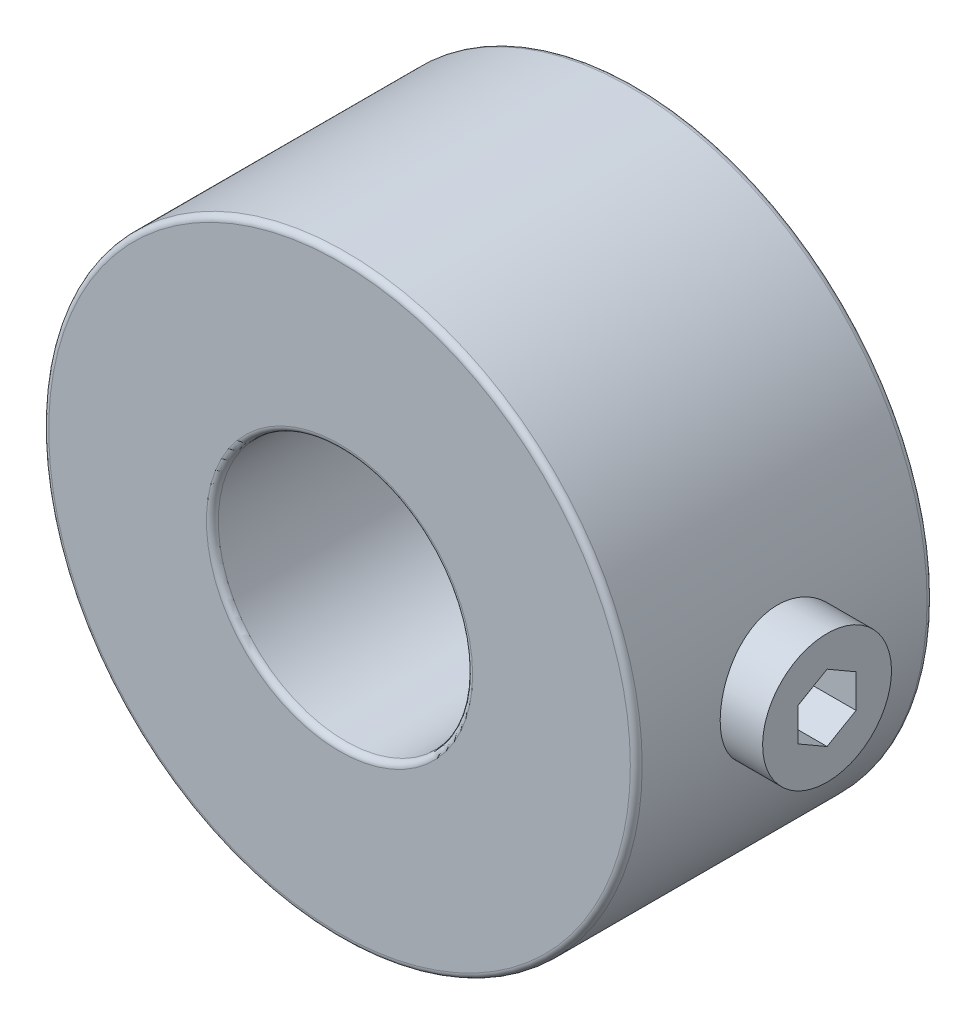
ISO-10303-21;
HEADER;
FILE_DESCRIPTION(('STEP AP214'),'2;1');
FILE_NAME('part.step','',(''),(''),'','','');
FILE_SCHEMA(('AUTOMOTIVE_DESIGN { 1 0 10303 214 1 1 1 1 }'));
ENDSEC;
DATA;
#1=APPLICATION_CONTEXT('core data for automotive mechanical design processes');
#2=APPLICATION_PROTOCOL_DEFINITION('international standard','automotive_design',2000,#1);
#3=PRODUCT_CONTEXT('',#1,'mechanical');
#4=PRODUCT('Part','Part','',(#3));
#5=PRODUCT_RELATED_PRODUCT_CATEGORY('part','',(#4));
#6=PRODUCT_DEFINITION_FORMATION('','',#4);
#7=PRODUCT_DEFINITION_CONTEXT('part definition',#1,'design');
#8=PRODUCT_DEFINITION('design','',#6,#7);
#9=PRODUCT_DEFINITION_SHAPE('','',#8);
#10=(LENGTH_UNIT() NAMED_UNIT(*) SI_UNIT(.MILLI.,.METRE.));
#11=(NAMED_UNIT(*) PLANE_ANGLE_UNIT() SI_UNIT($,.RADIAN.));
#12=(NAMED_UNIT(*) SI_UNIT($,.STERADIAN.) SOLID_ANGLE_UNIT());
#13=UNCERTAINTY_MEASURE_WITH_UNIT(LENGTH_MEASURE(1.E-05),#10,'distance_accuracy_value','');
#14=(GEOMETRIC_REPRESENTATION_CONTEXT(3) GLOBAL_UNCERTAINTY_ASSIGNED_CONTEXT((#13)) GLOBAL_UNIT_ASSIGNED_CONTEXT((#10,
#11,#12)) REPRESENTATION_CONTEXT('',''));
#15=CARTESIAN_POINT('',(0.,0.,0.));
#16=DIRECTION('',(0.,0.,1.));
#17=DIRECTION('',(1.,0.,0.));
#18=AXIS2_PLACEMENT_3D('',#15,#16,#17);
#19=CARTESIAN_POINT('',(6.35,0.,5.55625));
#20=DIRECTION('',(1.,0.,0.));
#21=DIRECTION('',(0.,1.,0.));
#22=AXIS2_PLACEMENT_3D('',#19,#20,#21);
#23=PLANE('',#22);
#24=CARTESIAN_POINT('',(6.35,0.,5.55625));
#25=DIRECTION('',(-1.,0.,0.));
#26=DIRECTION('',(0.,-1.,0.));
#27=AXIS2_PLACEMENT_3D('',#24,#25,#26);
#28=CIRCLE('',#27,2.413);
#29=CARTESIAN_POINT('',(6.35,-2.41300000000001,5.55625));
#30=VERTEX_POINT('',#29);
#31=EDGE_CURVE('E12',#30,#30,#28,.T.);
#32=ORIENTED_EDGE('',*,*,#31,.T.);
#33=EDGE_LOOP('',(#32));
#34=FACE_BOUND('',#33,.T.);
#35=ADVANCED_FACE('F44',(#34),#23,.F.);
#36=CARTESIAN_POINT('',(6.34999999999999,0.,5.55625));
#37=DIRECTION('',(-1.,0.,0.));
#38=DIRECTION('',(0.,-1.,0.));
#39=AXIS2_PLACEMENT_3D('',#36,#37,#38);
#40=CYLINDRICAL_SURFACE('',#39,2.413);
#41=ORIENTED_EDGE('',*,*,#31,.F.);
#42=EDGE_LOOP('',(#41));
#43=FACE_BOUND('',#42,.T.);
#44=CARTESIAN_POINT('',(12.7,0.,5.55625));
#45=DIRECTION('',(-1.,0.,0.));
#46=DIRECTION('',(0.,-1.,0.));
#47=AXIS2_PLACEMENT_3D('',#44,#45,#46);
#48=CIRCLE('',#47,2.413);
#49=CARTESIAN_POINT('',(12.7,-2.413,5.55625));
#50=VERTEX_POINT('',#49);
#51=EDGE_CURVE('E51',#50,#50,#48,.T.);
#52=ORIENTED_EDGE('',*,*,#51,.T.);
#53=EDGE_LOOP('',(#52));
#54=FACE_BOUND('',#53,.T.);
#55=ADVANCED_FACE('F154',(#43,#54),#40,.T.);
#56=CARTESIAN_POINT('',(12.7,0.,5.55625));
#57=DIRECTION('',(-1.,0.,0.));
#58=DIRECTION('',(0.,-1.,0.));
#59=AXIS2_PLACEMENT_3D('',#56,#57,#58);
#60=PLANE('',#59);
#61=DIRECTION('',(0.,-0.5,0.866025403784439));
#62=VECTOR('',#61,1.);
#63=CARTESIAN_POINT('',(12.7,1.25383157959913,5.55625));
#64=LINE('',#63,#62);
#65=CARTESIAN_POINT('',(12.7,1.25383157959913,5.55625));
#66=VERTEX_POINT('',#65);
#67=CARTESIAN_POINT('',(12.7,0.626915789799572,6.6421));
#68=VERTEX_POINT('',#67);
#69=EDGE_CURVE('E112',#66,#68,#64,.T.);
#70=ORIENTED_EDGE('',*,*,#69,.F.);
#71=DIRECTION('',(0.,0.5,0.866025403784439));
#72=VECTOR('',#71,1.);
#73=CARTESIAN_POINT('',(12.7,0.626915789799572,4.4704));
#74=LINE('',#73,#72);
#75=CARTESIAN_POINT('',(12.7,0.626915789799572,4.4704));
#76=VERTEX_POINT('',#75);
#77=EDGE_CURVE('E58',#76,#66,#74,.T.);
#78=ORIENTED_EDGE('',*,*,#77,.F.);
#79=DIRECTION('',(0.,1.,0.));
#80=VECTOR('',#79,1.);
#81=CARTESIAN_POINT('',(12.7,-0.626915789799543,4.4704));
#82=LINE('',#81,#80);
#83=CARTESIAN_POINT('',(12.7,-0.626915789799543,4.4704));
#84=VERTEX_POINT('',#83);
#85=EDGE_CURVE('E128',#84,#76,#82,.T.);
#86=ORIENTED_EDGE('',*,*,#85,.F.);
#87=DIRECTION('',(0.,0.5,-0.866025403784439));
#88=VECTOR('',#87,1.);
#89=CARTESIAN_POINT('',(12.7,-1.2538315795991,5.55625));
#90=LINE('',#89,#88);
#91=CARTESIAN_POINT('',(12.7,-1.2538315795991,5.55625));
#92=VERTEX_POINT('',#91);
#93=EDGE_CURVE('E122',#92,#84,#90,.T.);
#94=ORIENTED_EDGE('',*,*,#93,.F.);
#95=DIRECTION('',(0.,-0.5,-0.866025403784439));
#96=VECTOR('',#95,1.);
#97=CARTESIAN_POINT('',(12.7,-0.626915789799542,6.6421));
#98=LINE('',#97,#96);
#99=CARTESIAN_POINT('',(12.7,-0.626915789799542,6.6421));
#100=VERTEX_POINT('',#99);
#101=EDGE_CURVE('E120',#100,#92,#98,.T.);
#102=ORIENTED_EDGE('',*,*,#101,.F.);
#103=DIRECTION('',(0.,-1.,0.));
#104=VECTOR('',#103,1.);
#105=CARTESIAN_POINT('',(12.7,0.626915789799572,6.6421));
#106=LINE('',#105,#104);
#107=EDGE_CURVE('E101',#68,#100,#106,.T.);
#108=ORIENTED_EDGE('',*,*,#107,.F.);
#109=EDGE_LOOP('',(#70,#78,#86,#94,#102,#108));
#110=FACE_BOUND('',#109,.T.);
#111=ORIENTED_EDGE('',*,*,#51,.F.);
#112=EDGE_LOOP('',(#111));
#113=FACE_BOUND('',#112,.T.);
#114=ADVANCED_FACE('F116',(#110,#113),#60,.F.);
#115=CARTESIAN_POINT('',(11.1125,0.626915789799572,4.4704));
#116=DIRECTION('',(0.,0.866025403784439,-0.5));
#117=DIRECTION('',(0.,0.5,0.866025403784439));
#118=AXIS2_PLACEMENT_3D('',#115,#116,#117);
#119=PLANE('',#118);
#120=ORIENTED_EDGE('',*,*,#77,.T.);
#121=DIRECTION('',(1.,0.,0.));
#122=VECTOR('',#121,1.);
#123=CARTESIAN_POINT('',(11.1125,1.25383157959913,5.55625));
#124=LINE('',#123,#122);
#125=CARTESIAN_POINT('',(11.1125,1.25383157959913,5.55625));
#126=VERTEX_POINT('',#125);
#127=EDGE_CURVE('E109',#126,#66,#124,.T.);
#128=ORIENTED_EDGE('',*,*,#127,.F.);
#129=DIRECTION('',(0.,0.5,0.866025403784439));
#130=VECTOR('',#129,1.);
#131=CARTESIAN_POINT('',(11.1125,0.626915789799572,4.4704));
#132=LINE('',#131,#130);
#133=CARTESIAN_POINT('',(11.1125,0.626915789799572,4.4704));
#134=VERTEX_POINT('',#133);
#135=EDGE_CURVE('E130',#134,#126,#132,.T.);
#136=ORIENTED_EDGE('',*,*,#135,.F.);
#137=DIRECTION('',(1.,0.,0.));
#138=VECTOR('',#137,1.);
#139=CARTESIAN_POINT('',(11.1125,0.626915789799572,4.4704));
#140=LINE('',#139,#138);
#141=EDGE_CURVE('E65',#134,#76,#140,.T.);
#142=ORIENTED_EDGE('',*,*,#141,.T.);
#143=EDGE_LOOP('',(#120,#128,#136,#142));
#144=FACE_BOUND('',#143,.T.);
#145=ADVANCED_FACE('F156',(#144),#119,.F.);
#146=CARTESIAN_POINT('',(11.1125,-0.626915789799543,4.4704));
#147=DIRECTION('',(0.,0.,-1.));
#148=DIRECTION('',(-1.,0.,0.));
#149=AXIS2_PLACEMENT_3D('',#146,#147,#148);
#150=PLANE('',#149);
#151=ORIENTED_EDGE('',*,*,#85,.T.);
#152=ORIENTED_EDGE('',*,*,#141,.F.);
#153=DIRECTION('',(0.,1.,0.));
#154=VECTOR('',#153,1.);
#155=CARTESIAN_POINT('',(11.1125,-0.626915789799543,4.4704));
#156=LINE('',#155,#154);
#157=CARTESIAN_POINT('',(11.1125,-0.626915789799543,4.4704));
#158=VERTEX_POINT('',#157);
#159=EDGE_CURVE('E142',#158,#134,#156,.T.);
#160=ORIENTED_EDGE('',*,*,#159,.F.);
#161=DIRECTION('',(1.,0.,0.));
#162=VECTOR('',#161,1.);
#163=CARTESIAN_POINT('',(11.1125,-0.626915789799543,4.4704));
#164=LINE('',#163,#162);
#165=EDGE_CURVE('E146',#158,#84,#164,.T.);
#166=ORIENTED_EDGE('',*,*,#165,.T.);
#167=EDGE_LOOP('',(#151,#152,#160,#166));
#168=FACE_BOUND('',#167,.T.);
#169=ADVANCED_FACE('F162',(#168),#150,.F.);
#170=CARTESIAN_POINT('',(11.1125,-1.2538315795991,5.55625));
#171=DIRECTION('',(0.,-0.866025403784439,-0.5));
#172=DIRECTION('',(0.,0.5,-0.866025403784439));
#173=AXIS2_PLACEMENT_3D('',#170,#171,#172);
#174=PLANE('',#173);
#175=ORIENTED_EDGE('',*,*,#93,.T.);
#176=ORIENTED_EDGE('',*,*,#165,.F.);
#177=DIRECTION('',(0.,0.5,-0.866025403784439));
#178=VECTOR('',#177,1.);
#179=CARTESIAN_POINT('',(11.1125,-1.2538315795991,5.55625));
#180=LINE('',#179,#178);
#181=CARTESIAN_POINT('',(11.1125,-1.2538315795991,5.55625));
#182=VERTEX_POINT('',#181);
#183=EDGE_CURVE('E139',#182,#158,#180,.T.);
#184=ORIENTED_EDGE('',*,*,#183,.F.);
#185=DIRECTION('',(1.,0.,0.));
#186=VECTOR('',#185,1.);
#187=CARTESIAN_POINT('',(11.1125,-1.2538315795991,5.55625));
#188=LINE('',#187,#186);
#189=EDGE_CURVE('E148',#182,#92,#188,.T.);
#190=ORIENTED_EDGE('',*,*,#189,.T.);
#191=EDGE_LOOP('',(#175,#176,#184,#190));
#192=FACE_BOUND('',#191,.T.);
#193=ADVANCED_FACE('F193',(#192),#174,.F.);
#194=CARTESIAN_POINT('',(11.1125,-0.626915789799542,6.6421));
#195=DIRECTION('',(0.,-0.866025403784439,0.5));
#196=DIRECTION('',(0.,-0.5,-0.866025403784439));
#197=AXIS2_PLACEMENT_3D('',#194,#195,#196);
#198=PLANE('',#197);
#199=ORIENTED_EDGE('',*,*,#101,.T.);
#200=ORIENTED_EDGE('',*,*,#189,.F.);
#201=DIRECTION('',(0.,-0.5,-0.866025403784439));
#202=VECTOR('',#201,1.);
#203=CARTESIAN_POINT('',(11.1125,-0.626915789799542,6.6421));
#204=LINE('',#203,#202);
#205=CARTESIAN_POINT('',(11.1125,-0.626915789799542,6.6421));
#206=VERTEX_POINT('',#205);
#207=EDGE_CURVE('E136',#206,#182,#204,.T.);
#208=ORIENTED_EDGE('',*,*,#207,.F.);
#209=DIRECTION('',(1.,0.,0.));
#210=VECTOR('',#209,1.);
#211=CARTESIAN_POINT('',(11.1125,-0.626915789799542,6.6421));
#212=LINE('',#211,#210);
#213=EDGE_CURVE('E108',#206,#100,#212,.T.);
#214=ORIENTED_EDGE('',*,*,#213,.T.);
#215=EDGE_LOOP('',(#199,#200,#208,#214));
#216=FACE_BOUND('',#215,.T.);
#217=ADVANCED_FACE('F202',(#216),#198,.F.);
#218=CARTESIAN_POINT('',(11.1125,0.626915789799572,6.6421));
#219=DIRECTION('',(0.,0.,1.));
#220=DIRECTION('',(1.,0.,0.));
#221=AXIS2_PLACEMENT_3D('',#218,#219,#220);
#222=PLANE('',#221);
#223=ORIENTED_EDGE('',*,*,#107,.T.);
#224=ORIENTED_EDGE('',*,*,#213,.F.);
#225=DIRECTION('',(0.,-1.,0.));
#226=VECTOR('',#225,1.);
#227=CARTESIAN_POINT('',(11.1125,0.626915789799572,6.6421));
#228=LINE('',#227,#226);
#229=CARTESIAN_POINT('',(11.1125,0.626915789799572,6.6421));
#230=VERTEX_POINT('',#229);
#231=EDGE_CURVE('E104',#230,#206,#228,.T.);
#232=ORIENTED_EDGE('',*,*,#231,.F.);
#233=DIRECTION('',(1.,0.,0.));
#234=VECTOR('',#233,1.);
#235=CARTESIAN_POINT('',(11.1125,0.626915789799572,6.6421));
#236=LINE('',#235,#234);
#237=EDGE_CURVE('E97',#230,#68,#236,.T.);
#238=ORIENTED_EDGE('',*,*,#237,.T.);
#239=EDGE_LOOP('',(#223,#224,#232,#238));
#240=FACE_BOUND('',#239,.T.);
#241=ADVANCED_FACE('F99',(#240),#222,.F.);
#242=CARTESIAN_POINT('',(11.1125,1.25383157959913,5.55625));
#243=DIRECTION('',(0.,0.866025403784439,0.5));
#244=DIRECTION('',(0.,-0.5,0.866025403784439));
#245=AXIS2_PLACEMENT_3D('',#242,#243,#244);
#246=PLANE('',#245);
#247=ORIENTED_EDGE('',*,*,#69,.T.);
#248=ORIENTED_EDGE('',*,*,#237,.F.);
#249=DIRECTION('',(0.,-0.5,0.866025403784439));
#250=VECTOR('',#249,1.);
#251=CARTESIAN_POINT('',(11.1125,1.25383157959913,5.55625));
#252=LINE('',#251,#250);
#253=EDGE_CURVE('E133',#126,#230,#252,.T.);
#254=ORIENTED_EDGE('',*,*,#253,.F.);
#255=ORIENTED_EDGE('',*,*,#127,.T.);
#256=EDGE_LOOP('',(#247,#248,#254,#255));
#257=FACE_BOUND('',#256,.T.);
#258=ADVANCED_FACE('F113',(#257),#246,.F.);
#259=CARTESIAN_POINT('',(11.1125,1.88074736939868,6.6421));
#260=DIRECTION('',(1.,0.,0.));
#261=DIRECTION('',(0.,0.,-1.));
#262=AXIS2_PLACEMENT_3D('',#259,#260,#261);
#263=PLANE('',#262);
#264=ORIENTED_EDGE('',*,*,#135,.T.);
#265=ORIENTED_EDGE('',*,*,#253,.T.);
#266=ORIENTED_EDGE('',*,*,#231,.T.);
#267=ORIENTED_EDGE('',*,*,#207,.T.);
#268=ORIENTED_EDGE('',*,*,#183,.T.);
#269=ORIENTED_EDGE('',*,*,#159,.T.);
#270=EDGE_LOOP('',(#264,#265,#266,#267,#268,#269));
#271=FACE_BOUND('',#270,.T.);
#272=ADVANCED_FACE('F229',(#271),#263,.T.);
#273=CLOSED_SHELL('',(#35,#55,#114,#145,#169,#193,#217,#241,#258,#272));
#274=MANIFOLD_SOLID_BREP('B2',#273);
#275=CARTESIAN_POINT('',(0.,0.,11.1125));
#276=DIRECTION('',(0.,0.,1.));
#277=DIRECTION('',(1.,0.,0.));
#278=AXIS2_PLACEMENT_3D('',#275,#276,#277);
#279=PLANE('',#278);
#280=CARTESIAN_POINT('',(0.,0.,11.1125));
#281=DIRECTION('',(0.,0.,1.));
#282=DIRECTION('',(1.,0.,0.));
#283=AXIS2_PLACEMENT_3D('',#280,#281,#282);
#284=CIRCLE('',#283,4.98475);
#285=CARTESIAN_POINT('',(4.98475,0.,11.1125));
#286=VERTEX_POINT('',#285);
#287=EDGE_CURVE('E261',#286,#286,#284,.F.);
#288=ORIENTED_EDGE('',*,*,#287,.T.);
#289=EDGE_LOOP('',(#288));
#290=FACE_BOUND('',#289,.T.);
#291=CARTESIAN_POINT('',(0.,0.,11.1125));
#292=DIRECTION('',(0.,0.,1.));
#293=DIRECTION('',(1.,0.,0.));
#294=AXIS2_PLACEMENT_3D('',#291,#292,#293);
#295=CIRCLE('',#294,10.89025);
#296=CARTESIAN_POINT('',(10.89025,0.,11.1125));
#297=VERTEX_POINT('',#296);
#298=EDGE_CURVE('E265',#297,#297,#295,.T.);
#299=ORIENTED_EDGE('',*,*,#298,.T.);
#300=EDGE_LOOP('',(#299));
#301=FACE_BOUND('',#300,.T.);
#302=ADVANCED_FACE('F249',(#290,#301),#279,.T.);
#303=CARTESIAN_POINT('',(0.,0.,0.));
#304=DIRECTION('',(0.,0.,1.));
#305=DIRECTION('',(1.,0.,0.));
#306=AXIS2_PLACEMENT_3D('',#303,#304,#305);
#307=PLANE('',#306);
#308=CARTESIAN_POINT('',(0.,0.,0.));
#309=DIRECTION('',(0.,0.,1.));
#310=DIRECTION('',(1.,0.,0.));
#311=AXIS2_PLACEMENT_3D('',#308,#309,#310);
#312=CIRCLE('',#311,4.98475);
#313=CARTESIAN_POINT('',(4.98475,0.,0.));
#314=VERTEX_POINT('',#313);
#315=EDGE_CURVE('E276',#314,#314,#312,.T.);
#316=ORIENTED_EDGE('',*,*,#315,.T.);
#317=EDGE_LOOP('',(#316));
#318=FACE_BOUND('',#317,.T.);
#319=CARTESIAN_POINT('',(0.,0.,0.));
#320=DIRECTION('',(0.,0.,1.));
#321=DIRECTION('',(1.,0.,0.));
#322=AXIS2_PLACEMENT_3D('',#319,#320,#321);
#323=CIRCLE('',#322,10.89025);
#324=CARTESIAN_POINT('',(10.89025,0.,0.));
#325=VERTEX_POINT('',#324);
#326=EDGE_CURVE('E279',#325,#325,#323,.F.);
#327=ORIENTED_EDGE('',*,*,#326,.T.);
#328=EDGE_LOOP('',(#327));
#329=FACE_BOUND('',#328,.T.);
#330=ADVANCED_FACE('F320',(#318,#329),#307,.F.);
#331=CARTESIAN_POINT('',(0.,0.,11.1125));
#332=DIRECTION('',(0.,0.,-1.));
#333=DIRECTION('',(-1.,0.,0.));
#334=AXIS2_PLACEMENT_3D('',#331,#332,#333);
#335=CYLINDRICAL_SURFACE('',#334,11.1125);
#336=CARTESIAN_POINT('',(0.,0.,0.22225));
#337=DIRECTION('',(0.,0.,1.));
#338=DIRECTION('',(1.,0.,0.));
#339=AXIS2_PLACEMENT_3D('',#336,#337,#338);
#340=CIRCLE('',#339,11.1125);
#341=CARTESIAN_POINT('',(11.1125,0.,0.22225));
#342=VERTEX_POINT('',#341);
#343=EDGE_CURVE('E43',#342,#342,#340,.T.);
#344=ORIENTED_EDGE('',*,*,#343,.T.);
#345=EDGE_LOOP('',(#344));
#346=FACE_BOUND('',#345,.T.);
#347=CARTESIAN_POINT('',(0.,0.,10.89025));
#348=DIRECTION('',(0.,0.,1.));
#349=DIRECTION('',(1.,0.,0.));
#350=AXIS2_PLACEMENT_3D('',#347,#348,#349);
#351=CIRCLE('',#350,11.1125);
#352=CARTESIAN_POINT('',(11.1125,0.,10.89025));
#353=VERTEX_POINT('',#352);
#354=EDGE_CURVE('E257',#353,#353,#351,.F.);
#355=ORIENTED_EDGE('',*,*,#354,.T.);
#356=EDGE_LOOP('',(#355));
#357=FACE_BOUND('',#356,.T.);
#358=CARTESIAN_POINT('',(11.1125,0.,3.14325));
#359=CARTESIAN_POINT('',(11.1124975280039,-0.133855529141843,3.14325460454641));
#360=CARTESIAN_POINT('',(11.1100568684647,-0.267766919028595,3.15442558866474));
#361=CARTESIAN_POINT('',(11.1005563062725,-0.531787618795251,3.19876893976213));
#362=CARTESIAN_POINT('',(11.0934930704615,-0.661894114341644,3.2319571827572));
#363=CARTESIAN_POINT('',(11.0755339912949,-0.914451068970197,3.319247838087));
#364=CARTESIAN_POINT('',(11.0646421234579,-1.03690931498743,3.37332856214063));
#365=CARTESIAN_POINT('',(11.0402020640344,-1.27100932444267,3.50080057708205));
#366=CARTESIAN_POINT('',(11.0266539489621,-1.38265139930638,3.57419131175819));
#367=CARTESIAN_POINT('',(10.9981464124285,-1.59372168491606,3.73942953819085));
#368=CARTESIAN_POINT('',(10.983169697744,-1.69295417928931,3.83152407044178));
#369=CARTESIAN_POINT('',(10.9536151261007,-1.87469162764956,4.03102525353164));
#370=CARTESIAN_POINT('',(10.9390373043966,-1.95719510721122,4.1384332526158));
#371=CARTESIAN_POINT('',(10.9117607129221,-2.10399339958369,4.36695608880966));
#372=CARTESIAN_POINT('',(10.8990841105214,-2.16808035726153,4.48820732976157));
#373=CARTESIAN_POINT('',(10.8772932361505,-2.27489327305033,4.74007895579433));
#374=CARTESIAN_POINT('',(10.8681785448635,-2.31762174569959,4.87069823590282));
#375=CARTESIAN_POINT('',(10.854719509637,-2.37985896667319,5.13547658947719));
#376=CARTESIAN_POINT('',(10.8503041104916,-2.39971396264727,5.26955058725739));
#377=CARTESIAN_POINT('',(10.8465301419249,-2.41671713251725,5.53919374348105));
#378=CARTESIAN_POINT('',(10.8471709602203,-2.41386805576501,5.67476271890464));
#379=CARTESIAN_POINT('',(10.8533726735643,-2.38582270982978,5.94097704317058));
#380=CARTESIAN_POINT('',(10.8588451102298,-2.36102820248518,6.07166708969689));
#381=CARTESIAN_POINT('',(10.8739536472808,-2.29043212712205,6.32698717882166));
#382=CARTESIAN_POINT('',(10.883589978236,-2.24462939579438,6.45161688541219));
#383=CARTESIAN_POINT('',(10.9060279883138,-2.13294685194189,6.69241044805206));
#384=CARTESIAN_POINT('',(10.9188539398813,-2.06691213942469,6.80850010397442));
#385=CARTESIAN_POINT('',(10.9462110818285,-1.91674906605571,7.02809963746108));
#386=CARTESIAN_POINT('',(10.9607425013559,-1.83261827253483,7.13160782075815));
#387=CARTESIAN_POINT('',(10.9902531172664,-1.64652234512412,7.3254197190785));
#388=CARTESIAN_POINT('',(11.0052352580363,-1.54421546744718,7.41539516683343));
#389=CARTESIAN_POINT('',(11.0336771640282,-1.3257957270418,7.57696459139419));
#390=CARTESIAN_POINT('',(11.0471369024379,-1.20968262123465,7.64855824449165));
#391=CARTESIAN_POINT('',(11.0710601579348,-0.966548934519939,7.77141111473137));
#392=CARTESIAN_POINT('',(11.0815173954727,-0.839506205383432,7.82262779966711));
#393=CARTESIAN_POINT('',(11.098210647842,-0.578340377891702,7.90289583652769));
#394=CARTESIAN_POINT('',(11.1044472674401,-0.444218296897429,7.93195036411393));
#395=CARTESIAN_POINT('',(11.1119106683836,-0.175517229746213,7.96659299009544));
#396=CARTESIAN_POINT('',(11.1132331843123,-0.0409986484807947,7.97262957661009));
#397=CARTESIAN_POINT('',(11.1109874328115,0.227124846937516,7.96227988739705));
#398=CARTESIAN_POINT('',(11.107419492068,0.360729821520839,7.94589510943256));
#399=CARTESIAN_POINT('',(11.0958540981981,0.621751002653054,7.89153975053368));
#400=CARTESIAN_POINT('',(11.0879048480894,0.74921842617076,7.85380395481725));
#401=CARTESIAN_POINT('',(11.0684663997485,0.996014547772027,7.7580779880001));
#402=CARTESIAN_POINT('',(11.0569769029564,1.1153425583967,7.70008610858606));
#403=CARTESIAN_POINT('',(11.0314960495608,1.34433031629033,7.56455657178823));
#404=CARTESIAN_POINT('',(11.0174717034347,1.45383003224851,7.48675486864505));
#405=CARTESIAN_POINT('',(10.9885449959568,1.6583804418905,7.31416240245802));
#406=CARTESIAN_POINT('',(10.9736425224965,1.75342928509573,7.21936946701557));
#407=CARTESIAN_POINT('',(10.9443091896182,1.92814930880049,7.01342872879738));
#408=CARTESIAN_POINT('',(10.9298917946796,2.00751015764455,6.90201536982623));
#409=CARTESIAN_POINT('',(10.9034701115839,2.14639558069368,6.66717816361637));
#410=CARTESIAN_POINT('',(10.8914657195533,2.20592100883421,6.54375483371502));
#411=CARTESIAN_POINT('',(10.8713427689796,2.30304689743948,6.28906055985279));
#412=CARTESIAN_POINT('',(10.8632025311295,2.34076994331032,6.15783816009427));
#413=CARTESIAN_POINT('',(10.8516898272035,2.39358058516886,5.89071796830105));
#414=CARTESIAN_POINT('',(10.8483166113587,2.40867174077811,5.75482091495215));
#415=CARTESIAN_POINT('',(10.8467666387696,2.41564043093312,5.48533681909589));
#416=CARTESIAN_POINT('',(10.8484797682884,2.40800985523194,5.35176289420149));
#417=CARTESIAN_POINT('',(10.8566606932763,2.37085011274779,5.08785271270825));
#418=CARTESIAN_POINT('',(10.8631284343837,2.34132119633917,4.95751641910961));
#419=CARTESIAN_POINT('',(10.8800365373732,2.26143907721506,4.70416517741857));
#420=CARTESIAN_POINT('',(10.8904634214229,2.21115647484169,4.58112700990512));
#421=CARTESIAN_POINT('',(10.914120444751,2.09125534170817,4.34515969725943));
#422=CARTESIAN_POINT('',(10.9273508711762,2.02163483007707,4.23223158931493));
#423=CARTESIAN_POINT('',(10.9554538791863,1.86339838217066,4.01726302081067));
#424=CARTESIAN_POINT('',(10.970353936784,1.77443147629977,3.91548444877795));
#425=CARTESIAN_POINT('',(10.9999316426327,1.58074013631664,3.72813973177502));
#426=CARTESIAN_POINT('',(11.0146092387153,1.47601206718764,3.6425773370738));
#427=CARTESIAN_POINT('',(11.042310018895,1.25216306541202,3.48905096976753));
#428=CARTESIAN_POINT('',(11.0553097331224,1.13287570587793,3.42132518965695));
#429=CARTESIAN_POINT('',(11.0779550058168,0.884354350899144,3.30699199690189));
#430=CARTESIAN_POINT('',(11.0876033942244,0.755128860645581,3.26036675632295));
#431=CARTESIAN_POINT('',(11.1007238994831,0.521466413473585,3.19793133117081));
#432=CARTESIAN_POINT('',(11.1051127178862,0.418299685358179,3.17746472850356));
#433=CARTESIAN_POINT('',(11.1110016760529,0.210100056617827,3.15012254874187));
#434=CARTESIAN_POINT('',(11.1125019403442,0.105067236638558,3.14324638575283));
#435=CARTESIAN_POINT('',(11.1125,0.,3.14325));
#436=B_SPLINE_CURVE_WITH_KNOTS('',3,(#358,#359,#360,#361,#362,#363,#364,#365,#366,#367,#368,
#369,#370,#371,#372,#373,#374,#375,#376,#377,#378,#379,#380,#381,#382,#383,#384,#385,#386,#387,
#388,#389,#390,#391,#392,#393,#394,#395,#396,#397,#398,#399,#400,#401,#402,#403,#404,#405,#406,
#407,#408,#409,#410,#411,#412,#413,#414,#415,#416,#417,#418,#419,#420,#421,#422,#423,#424,#425,
#426,#427,#428,#429,#430,#431,#432,#433,#434,#435),.UNSPECIFIED.,.T.,.F.,(4,2,2,2,2,2,2,2,2,2,2,
2,2,2,2,2,2,2,2,2,2,2,2,2,2,2,2,2,2,2,2,2,2,2,2,2,2,2,4),(0.,0.40118201863746,0.802653633044936,
1.20370959874537,1.60475401356782,2.01148721047378,2.41825623957425,2.82945047930852,
3.2405962976622,3.64543304192561,4.05022076318961,4.44774774223424,4.84529673659099,
5.24596890126342,5.64669496228189,6.05595765926885,6.46522756298817,6.87534729679786,
7.28540825265671,7.68743738209581,8.08943965701218,8.48710493533424,8.88480375918238,
9.2881096847027,9.69146721136482,10.1021438743161,10.5128028549258,10.9211298332169,
11.3293925816984,11.7288817920231,12.1283664348646,12.5265031586309,12.9246806804225,
13.3307949699419,13.7370030660507,14.1483883310685,14.5594253630398,14.8743387897936,
15.1892386400841),.UNSPECIFIED.);
#437=CARTESIAN_POINT('',(11.1125,0.,3.14325));
#438=VERTEX_POINT('',#437);
#439=EDGE_CURVE('E282',#438,#438,#436,.T.);
#440=ORIENTED_EDGE('',*,*,#439,.T.);
#441=EDGE_LOOP('',(#440));
#442=FACE_BOUND('',#441,.T.);
#443=ADVANCED_FACE('F251',(#346,#357,#442),#335,.T.);
#444=CARTESIAN_POINT('',(0.,0.,11.1125));
#445=DIRECTION('',(0.,0.,-1.));
#446=DIRECTION('',(-1.,0.,0.));
#447=AXIS2_PLACEMENT_3D('',#444,#445,#446);
#448=CYLINDRICAL_SURFACE('',#447,4.7625);
#449=CARTESIAN_POINT('',(0.,0.,0.22225));
#450=DIRECTION('',(0.,0.,1.));
#451=DIRECTION('',(1.,0.,0.));
#452=AXIS2_PLACEMENT_3D('',#449,#450,#451);
#453=CIRCLE('',#452,4.7625);
#454=CARTESIAN_POINT('',(4.7625,0.,0.22225));
#455=VERTEX_POINT('',#454);
#456=EDGE_CURVE('E270',#455,#455,#453,.F.);
#457=ORIENTED_EDGE('',*,*,#456,.T.);
#458=EDGE_LOOP('',(#457));
#459=FACE_BOUND('',#458,.T.);
#460=CARTESIAN_POINT('',(0.,0.,10.89025));
#461=DIRECTION('',(0.,0.,1.));
#462=DIRECTION('',(1.,0.,0.));
#463=AXIS2_PLACEMENT_3D('',#460,#461,#462);
#464=CIRCLE('',#463,4.7625);
#465=CARTESIAN_POINT('',(4.7625,0.,10.89025));
#466=VERTEX_POINT('',#465);
#467=EDGE_CURVE('E273',#466,#466,#464,.T.);
#468=ORIENTED_EDGE('',*,*,#467,.T.);
#469=EDGE_LOOP('',(#468));
#470=FACE_BOUND('',#469,.T.);
#471=CARTESIAN_POINT('',(4.7625,0.,3.14325));
#472=CARTESIAN_POINT('',(4.76249188012536,-0.126649169989471,3.14325950085965));
#473=CARTESIAN_POINT('',(4.75739362869145,-0.253448771240009,3.15328039139374));
#474=CARTESIAN_POINT('',(4.7374986759061,-0.503284584888762,3.1929180212433));
#475=CARTESIAN_POINT('',(4.72268421315245,-0.626313472406526,3.22257064865291));
#476=CARTESIAN_POINT('',(4.68490559738032,-0.864618839509832,3.30000592178117));
#477=CARTESIAN_POINT('',(4.66197341641602,-0.979923651751686,3.34771749175409));
#478=CARTESIAN_POINT('',(4.61005152679328,-1.20071351455458,3.45954180105029));
#479=CARTESIAN_POINT('',(4.58106219126309,-1.30619916940959,3.52365353015793));
#480=CARTESIAN_POINT('',(4.51757958611899,-1.51166955891755,3.67094535638565));
#481=CARTESIAN_POINT('',(4.48285720856476,-1.61091451989384,3.75505717872779));
#482=CARTESIAN_POINT('',(4.41255032641904,-1.79457367080566,3.9379507231144));
#483=CARTESIAN_POINT('',(4.37696517049107,-1.87897623231331,4.03674383655147));
#484=CARTESIAN_POINT('',(4.30566577380489,-2.0373472926855,4.2556864240253));
#485=CARTESIAN_POINT('',(4.27016993289307,-2.1099366693159,4.37691310578961));
#486=CARTESIAN_POINT('',(4.20692439448885,-2.23339117146114,4.63183326790908));
#487=CARTESIAN_POINT('',(4.17916906374952,-2.28427210991042,4.76551758704391));
#488=CARTESIAN_POINT('',(4.13713770091992,-2.35950552281814,5.03333004191332));
#489=CARTESIAN_POINT('',(4.12214753896866,-2.38527718275492,5.1669416412182));
#490=CARTESIAN_POINT('',(4.10546522753347,-2.41389077594304,5.43736253660211));
#491=CARTESIAN_POINT('',(4.10375928611473,-2.41675649067176,5.57416836826895));
#492=CARTESIAN_POINT('',(4.11326680703791,-2.40051659080372,5.82889800012604));
#493=CARTESIAN_POINT('',(4.12290928369412,-2.38408320864943,5.94706539239194));
#494=CARTESIAN_POINT('',(4.15126596463633,-2.33435392559415,6.17866065036084));
#495=CARTESIAN_POINT('',(4.16998319194926,-2.30105240532798,6.29208692299143));
#496=CARTESIAN_POINT('',(4.21478445246222,-2.2179405014121,6.51422154033589));
#497=CARTESIAN_POINT('',(4.24102946061188,-2.16776471531076,6.62275916437178));
#498=CARTESIAN_POINT('',(4.29794256082229,-2.05261226003203,6.83040189582267));
#499=CARTESIAN_POINT('',(4.32861263914561,-1.98762893662852,6.92950273404975));
#500=CARTESIAN_POINT('',(4.39576034471746,-1.83481041047057,7.12909130830591));
#501=CARTESIAN_POINT('',(4.43247317271855,-1.74509874440939,7.22806825988622));
#502=CARTESIAN_POINT('',(4.50433131719932,-1.55022377726655,7.41021186443355));
#503=CARTESIAN_POINT('',(4.53947583889224,-1.44505275505379,7.49337056913312));
#504=CARTESIAN_POINT('',(4.6063311963252,-1.21574956455372,7.64534954588547));
#505=CARTESIAN_POINT('',(4.63779030658668,-1.09094195977516,7.71327053721547));
#506=CARTESIAN_POINT('',(4.69156395583514,-0.829676205999802,7.82658780926625));
#507=CARTESIAN_POINT('',(4.71388593505582,-0.693227645922142,7.87200242297996));
#508=CARTESIAN_POINT('',(4.74526824548201,-0.424880869717558,7.93520264052229));
#509=CARTESIAN_POINT('',(4.75528777608906,-0.293568483964219,7.95499436517171));
#510=CARTESIAN_POINT('',(4.76424448077321,-0.0291243143990894,7.97270504714242));
#511=CARTESIAN_POINT('',(4.76318711842965,0.10400654010943,7.97063478768969));
#512=CARTESIAN_POINT('',(4.75065721618122,0.356966618113464,7.94581028168628));
#513=CARTESIAN_POINT('',(4.74002523922596,0.477007494648107,7.92472515858118));
#514=CARTESIAN_POINT('',(4.71052219175233,0.71159599564283,7.86511358733806));
#515=CARTESIAN_POINT('',(4.69165022365323,0.826143020149534,7.82658523909581));
#516=CARTESIAN_POINT('',(4.64670633277272,1.0502184657147,7.73221156976462));
#517=CARTESIAN_POINT('',(4.6204476447536,1.15951663148593,7.67591167311342));
#518=CARTESIAN_POINT('',(4.5632321095873,1.36746797186693,7.54811174621717));
#519=CARTESIAN_POINT('',(4.53227328830131,1.46611664357035,7.47660532388197));
#520=CARTESIAN_POINT('',(4.46496330080072,1.66045566146343,7.3121657490604));
#521=CARTESIAN_POINT('',(4.42838263537785,1.75485954041948,7.21780368848643));
#522=CARTESIAN_POINT('',(4.35619895996272,1.9270898372021,7.01455605191696));
#523=CARTESIAN_POINT('',(4.32059668805825,2.00490402365911,6.90565985561132));
#524=CARTESIAN_POINT('',(4.25256664834519,2.14557932835792,6.66932083855773));
#525=CARTESIAN_POINT('',(4.2204001369157,2.20745276695422,6.54120813937795));
#526=CARTESIAN_POINT('',(4.16622004449994,2.30810110834239,6.27424498763757));
#527=CARTESIAN_POINT('',(4.14419306113273,2.34690652223803,6.13540899436231));
#528=CARTESIAN_POINT('',(4.11559214708887,2.39667650984358,5.86528626861085));
#529=CARTESIAN_POINT('',(4.10772935866686,2.40997137139681,5.73456865885109));
#530=CARTESIAN_POINT('',(4.10471909269507,2.41510017437088,5.47259178180221));
#531=CARTESIAN_POINT('',(4.10956558856468,2.4069442874578,5.34133280069543));
#532=CARTESIAN_POINT('',(4.13004566827808,2.37159568724449,5.09589273464877));
#533=CARTESIAN_POINT('',(4.14454958002308,2.34639260758052,4.98131840519907));
#534=CARTESIAN_POINT('',(4.18134498961912,2.28017249089328,4.7581661561788));
#535=CARTESIAN_POINT('',(4.20363904892869,2.23915025195246,4.64959022254115));
#536=CARTESIAN_POINT('',(4.25532018371053,2.13939345773968,4.43345385023535));
#537=CARTESIAN_POINT('',(4.28508228026456,2.07965672169698,4.32644834320411));
#538=CARTESIAN_POINT('',(4.34774609403191,1.94525312330718,4.12327551947885));
#539=CARTESIAN_POINT('',(4.38064946132294,1.87057839137305,4.02711395748927));
#540=CARTESIAN_POINT('',(4.45084946272285,1.69738591796994,3.83574954389178));
#541=CARTESIAN_POINT('',(4.48817732929177,1.59704956387471,3.74219379725406));
#542=CARTESIAN_POINT('',(4.55925234801881,1.38114473626408,3.57285511918928));
#543=CARTESIAN_POINT('',(4.59299749984119,1.26556783339425,3.49708208809918));
#544=CARTESIAN_POINT('',(4.65364913111884,1.02029109479322,3.36510902939543));
#545=CARTESIAN_POINT('',(4.68048308272043,0.890460384053466,3.30911446059195));
#546=CARTESIAN_POINT('',(4.7128886709925,0.68901766141954,3.2426296724603));
#547=CARTESIAN_POINT('',(4.72237914990017,0.620803069455486,3.22339312921357));
#548=CARTESIAN_POINT('',(4.73848995321274,0.482637383587706,3.19094816971584));
#549=CARTESIAN_POINT('',(4.74511199973301,0.412687358330088,3.17773613628941));
#550=CARTESIAN_POINT('',(4.75426521816766,0.285633171872797,3.15953381254557));
#551=CARTESIAN_POINT('',(4.75734644572558,0.228724551392879,3.15343424699674));
#552=CARTESIAN_POINT('',(4.761465700995,0.114554221734786,3.14529013668523));
#553=CARTESIAN_POINT('',(4.76250367320167,0.0572925030071186,3.14324570207977));
#554=CARTESIAN_POINT('',(4.7625,0.,3.14325));
#555=B_SPLINE_CURVE_WITH_KNOTS('',3,(#471,#472,#473,#474,#475,#476,#477,#478,#479,#480,#481,
#482,#483,#484,#485,#486,#487,#488,#489,#490,#491,#492,#493,#494,#495,#496,#497,#498,#499,#500,
#501,#502,#503,#504,#505,#506,#507,#508,#509,#510,#511,#512,#513,#514,#515,#516,#517,#518,#519,
#520,#521,#522,#523,#524,#525,#526,#527,#528,#529,#530,#531,#532,#533,#534,#535,#536,#537,#538,
#539,#540,#541,#542,#543,#544,#545,#546,#547,#548,#549,#550,#551,#552,#553,#554),.UNSPECIFIED.,
.T.,.F.,(4,2,2,2,2,2,2,2,2,2,2,2,2,2,2,2,2,2,2,2,2,2,2,2,2,2,2,2,2,2,2,2,2,2,2,2,2,2,2,2,2,4),
(0.,0.37972493875304,0.760145963260223,1.13908505180002,1.51800080410008,1.92027098436035,
2.3228549365916,2.75771654448942,3.19226084595142,3.60050561015404,4.00832647015917,
4.36573385249239,4.72326037807563,5.08908918981097,5.45508272341639,5.86889911452435,
6.28292289174841,6.71717919099467,7.15108117479049,7.54841100478899,7.94554486459919,
8.31088619266213,8.67626732722213,9.05187688113557,9.42764463638961,9.84105781272571,
10.2547747472458,10.6899997657243,11.1246478421442,11.5172452764923,11.9096565798085,
12.2627433690108,12.6159463651959,12.992802524914,13.3698577441264,13.7944166296879,
14.2192113260918,14.6482972916874,14.862546490938,15.0766668829149,15.2484390409036,
15.4202158650012),.UNSPECIFIED.);
#556=CARTESIAN_POINT('',(4.7625,0.,3.14325));
#557=VERTEX_POINT('',#556);
#558=EDGE_CURVE('E283',#557,#557,#555,.T.);
#559=ORIENTED_EDGE('',*,*,#558,.F.);
#560=EDGE_LOOP('',(#559));
#561=FACE_BOUND('',#560,.T.);
#562=ADVANCED_FACE('F292',(#459,#470,#561),#448,.F.);
#563=CARTESIAN_POINT('',(-6.82499465201256,0.,5.55625));
#564=DIRECTION('',(1.,0.,0.));
#565=DIRECTION('',(0.,0.,-1.));
#566=AXIS2_PLACEMENT_3D('',#563,#564,#565);
#567=CYLINDRICAL_SURFACE('',#566,2.413);
#568=ORIENTED_EDGE('',*,*,#558,.T.);
#569=EDGE_LOOP('',(#568));
#570=FACE_BOUND('',#569,.T.);
#571=ORIENTED_EDGE('',*,*,#439,.F.);
#572=EDGE_LOOP('',(#571));
#573=FACE_BOUND('',#572,.T.);
#574=ADVANCED_FACE('F295',(#570,#573),#567,.F.);
#575=CARTESIAN_POINT('',(0.,0.,0.22225));
#576=DIRECTION('',(0.,0.,1.));
#577=DIRECTION('',(1.,0.,0.));
#578=AXIS2_PLACEMENT_3D('',#575,#576,#577);
#579=TOROIDAL_SURFACE('',#578,4.98475,0.22225);
#580=ORIENTED_EDGE('',*,*,#456,.F.);
#581=EDGE_LOOP('',(#580));
#582=FACE_BOUND('',#581,.T.);
#583=ORIENTED_EDGE('',*,*,#315,.F.);
#584=EDGE_LOOP('',(#583));
#585=FACE_BOUND('',#584,.T.);
#586=ADVANCED_FACE('F299',(#582,#585),#579,.T.);
#587=CARTESIAN_POINT('',(0.,0.,10.89025));
#588=DIRECTION('',(0.,0.,1.));
#589=DIRECTION('',(1.,0.,0.));
#590=AXIS2_PLACEMENT_3D('',#587,#588,#589);
#591=TOROIDAL_SURFACE('',#590,4.98475,0.22225);
#592=ORIENTED_EDGE('',*,*,#287,.F.);
#593=EDGE_LOOP('',(#592));
#594=FACE_BOUND('',#593,.T.);
#595=ORIENTED_EDGE('',*,*,#467,.F.);
#596=EDGE_LOOP('',(#595));
#597=FACE_BOUND('',#596,.T.);
#598=ADVANCED_FACE('F304',(#594,#597),#591,.T.);
#599=CARTESIAN_POINT('',(0.,0.,0.22225));
#600=DIRECTION('',(0.,0.,1.));
#601=DIRECTION('',(1.,0.,0.));
#602=AXIS2_PLACEMENT_3D('',#599,#600,#601);
#603=TOROIDAL_SURFACE('',#602,10.89025,0.22225);
#604=ORIENTED_EDGE('',*,*,#326,.F.);
#605=EDGE_LOOP('',(#604));
#606=FACE_BOUND('',#605,.T.);
#607=ORIENTED_EDGE('',*,*,#343,.F.);
#608=EDGE_LOOP('',(#607));
#609=FACE_BOUND('',#608,.T.);
#610=ADVANCED_FACE('F308',(#606,#609),#603,.T.);
#611=CARTESIAN_POINT('',(0.,0.,10.89025));
#612=DIRECTION('',(0.,0.,1.));
#613=DIRECTION('',(1.,0.,0.));
#614=AXIS2_PLACEMENT_3D('',#611,#612,#613);
#615=TOROIDAL_SURFACE('',#614,10.89025,0.22225);
#616=ORIENTED_EDGE('',*,*,#354,.F.);
#617=EDGE_LOOP('',(#616));
#618=FACE_BOUND('',#617,.T.);
#619=ORIENTED_EDGE('',*,*,#298,.F.);
#620=EDGE_LOOP('',(#619));
#621=FACE_BOUND('',#620,.T.);
#622=ADVANCED_FACE('F312',(#618,#621),#615,.T.);
#623=CLOSED_SHELL('',(#302,#330,#443,#562,#574,#586,#598,#610,#622));
#624=MANIFOLD_SOLID_BREP('B6',#623);
#625=ADVANCED_BREP_SHAPE_REPRESENTATION('',(#18,#274,#624),#14);
#626=SHAPE_DEFINITION_REPRESENTATION(#9,#625);
ENDSEC;
END-ISO-10303-21;
